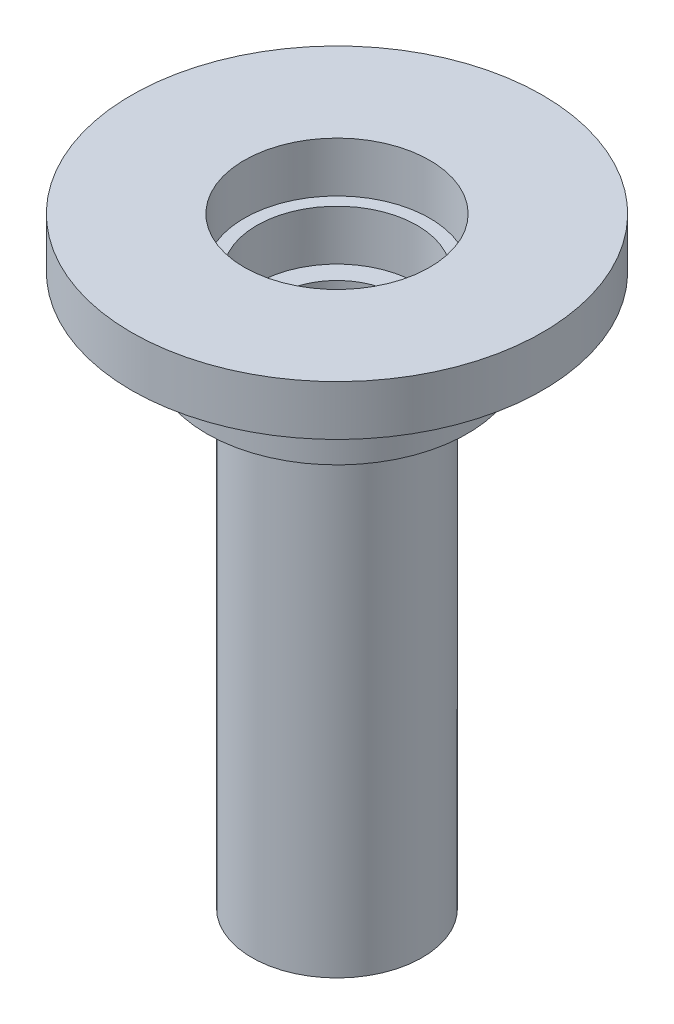
ISO-10303-21;
HEADER;
FILE_DESCRIPTION(('STEP AP214'),'2;1');
FILE_NAME('part.step','',(''),(''),'','','');
FILE_SCHEMA(('AUTOMOTIVE_DESIGN { 1 0 10303 214 1 1 1 1 }'));
ENDSEC;
DATA;
#1=APPLICATION_CONTEXT('core data for automotive mechanical design processes');
#2=APPLICATION_PROTOCOL_DEFINITION('international standard','automotive_design',2000,#1);
#3=PRODUCT_CONTEXT('',#1,'mechanical');
#4=PRODUCT('Part','Part','',(#3));
#5=PRODUCT_RELATED_PRODUCT_CATEGORY('part','',(#4));
#6=PRODUCT_DEFINITION_FORMATION('','',#4);
#7=PRODUCT_DEFINITION_CONTEXT('part definition',#1,'design');
#8=PRODUCT_DEFINITION('design','',#6,#7);
#9=PRODUCT_DEFINITION_SHAPE('','',#8);
#10=(LENGTH_UNIT() NAMED_UNIT(*) SI_UNIT(.MILLI.,.METRE.));
#11=(NAMED_UNIT(*) PLANE_ANGLE_UNIT() SI_UNIT($,.RADIAN.));
#12=(NAMED_UNIT(*) SI_UNIT($,.STERADIAN.) SOLID_ANGLE_UNIT());
#13=UNCERTAINTY_MEASURE_WITH_UNIT(LENGTH_MEASURE(1.E-05),#10,'distance_accuracy_value','');
#14=(GEOMETRIC_REPRESENTATION_CONTEXT(3) GLOBAL_UNCERTAINTY_ASSIGNED_CONTEXT((#13)) GLOBAL_UNIT_ASSIGNED_CONTEXT((#10,
#11,#12)) REPRESENTATION_CONTEXT('',''));
#15=CARTESIAN_POINT('',(0.,0.,0.));
#16=DIRECTION('',(0.,0.,1.));
#17=DIRECTION('',(1.,0.,0.));
#18=AXIS2_PLACEMENT_3D('',#15,#16,#17);
#19=CARTESIAN_POINT('',(-12.,-9.37974031758415,0.));
#20=DIRECTION('',(0.,-1.,0.));
#21=DIRECTION('',(0.,0.,-1.));
#22=AXIS2_PLACEMENT_3D('',#19,#20,#21);
#23=CYLINDRICAL_SURFACE('',#22,16.);
#24=CARTESIAN_POINT('',(-12.,120.,0.));
#25=DIRECTION('',(0.,-1.,0.));
#26=DIRECTION('',(0.,0.,-1.));
#27=AXIS2_PLACEMENT_3D('',#24,#25,#26);
#28=CIRCLE('',#27,16.);
#29=CARTESIAN_POINT('',(-12.,120.,-16.));
#30=VERTEX_POINT('',#29);
#31=EDGE_CURVE('E42',#30,#30,#28,.T.);
#32=ORIENTED_EDGE('',*,*,#31,.T.);
#33=EDGE_LOOP('',(#32));
#34=FACE_BOUND('',#33,.T.);
#35=CARTESIAN_POINT('',(-12.,130.,0.));
#36=DIRECTION('',(0.,1.,0.));
#37=DIRECTION('',(0.,0.,1.));
#38=AXIS2_PLACEMENT_3D('',#35,#36,#37);
#39=CIRCLE('',#38,16.);
#40=CARTESIAN_POINT('',(-12.,130.,16.));
#41=VERTEX_POINT('',#40);
#42=EDGE_CURVE('E38',#41,#41,#39,.T.);
#43=ORIENTED_EDGE('',*,*,#42,.T.);
#44=EDGE_LOOP('',(#43));
#45=FACE_BOUND('',#44,.T.);
#46=ADVANCED_FACE('F34',(#34,#45),#23,.F.);
#47=CARTESIAN_POINT('',(-12.,-9.37974031758415,0.));
#48=DIRECTION('',(0.,-1.,0.));
#49=DIRECTION('',(0.,0.,-1.));
#50=AXIS2_PLACEMENT_3D('',#47,#48,#49);
#51=CYLINDRICAL_SURFACE('',#50,12.);
#52=CARTESIAN_POINT('',(-12.,120.,0.));
#53=DIRECTION('',(0.,-1.,0.));
#54=DIRECTION('',(0.,0.,-1.));
#55=AXIS2_PLACEMENT_3D('',#52,#53,#54);
#56=CIRCLE('',#55,12.);
#57=CARTESIAN_POINT('',(-12.,120.,-12.));
#58=VERTEX_POINT('',#57);
#59=EDGE_CURVE('E10',#58,#58,#56,.T.);
#60=ORIENTED_EDGE('',*,*,#59,.F.);
#61=EDGE_LOOP('',(#60));
#62=FACE_BOUND('',#61,.T.);
#63=CARTESIAN_POINT('',(-12.,34.,0.));
#64=DIRECTION('',(0.,-1.,0.));
#65=DIRECTION('',(0.,0.,-1.));
#66=AXIS2_PLACEMENT_3D('',#63,#64,#65);
#67=CIRCLE('',#66,12.);
#68=CARTESIAN_POINT('',(-12.,34.,-12.));
#69=VERTEX_POINT('',#68);
#70=EDGE_CURVE('E54',#69,#69,#67,.T.);
#71=ORIENTED_EDGE('',*,*,#70,.T.);
#72=EDGE_LOOP('',(#71));
#73=FACE_BOUND('',#72,.T.);
#74=ADVANCED_FACE('F36',(#62,#73),#51,.F.);
#75=CARTESIAN_POINT('',(-12.,-9.37974031758415,0.));
#76=DIRECTION('',(0.,-1.,0.));
#77=DIRECTION('',(0.,0.,-1.));
#78=AXIS2_PLACEMENT_3D('',#75,#76,#77);
#79=CYLINDRICAL_SURFACE('',#78,17.);
#80=CARTESIAN_POINT('',(-12.,115.,0.));
#81=DIRECTION('',(0.,-1.,0.));
#82=DIRECTION('',(0.,0.,-1.));
#83=AXIS2_PLACEMENT_3D('',#80,#81,#82);
#84=CIRCLE('',#83,17.);
#85=CARTESIAN_POINT('',(-12.,115.,-17.));
#86=VERTEX_POINT('',#85);
#87=EDGE_CURVE('E53',#86,#86,#84,.T.);
#88=ORIENTED_EDGE('',*,*,#87,.T.);
#89=EDGE_LOOP('',(#88));
#90=FACE_BOUND('',#89,.T.);
#91=CARTESIAN_POINT('',(-12.,20.,0.));
#92=DIRECTION('',(0.,-1.,0.));
#93=DIRECTION('',(0.,0.,-1.));
#94=AXIS2_PLACEMENT_3D('',#91,#92,#93);
#95=CIRCLE('',#94,17.);
#96=CARTESIAN_POINT('',(-12.,20.,-17.));
#97=VERTEX_POINT('',#96);
#98=EDGE_CURVE('E51',#97,#97,#95,.F.);
#99=ORIENTED_EDGE('',*,*,#98,.T.);
#100=EDGE_LOOP('',(#99));
#101=FACE_BOUND('',#100,.T.);
#102=ADVANCED_FACE('F97',(#90,#101),#79,.T.);
#103=CARTESIAN_POINT('',(0.,120.,0.));
#104=DIRECTION('',(0.,1.,0.));
#105=DIRECTION('',(0.,0.,1.));
#106=AXIS2_PLACEMENT_3D('',#103,#104,#105);
#107=PLANE('',#106);
#108=ORIENTED_EDGE('',*,*,#59,.T.);
#109=EDGE_LOOP('',(#108));
#110=FACE_BOUND('',#109,.T.);
#111=ORIENTED_EDGE('',*,*,#31,.F.);
#112=EDGE_LOOP('',(#111));
#113=FACE_BOUND('',#112,.T.);
#114=ADVANCED_FACE('F88',(#110,#113),#107,.T.);
#115=CARTESIAN_POINT('',(4.,140.,0.));
#116=DIRECTION('',(0.,1.,0.));
#117=DIRECTION('',(0.,0.,1.));
#118=AXIS2_PLACEMENT_3D('',#115,#116,#117);
#119=PLANE('',#118);
#120=CARTESIAN_POINT('',(-12.,140.,0.));
#121=DIRECTION('',(0.,1.,0.));
#122=DIRECTION('',(0.,0.,1.));
#123=AXIS2_PLACEMENT_3D('',#120,#121,#122);
#124=CIRCLE('',#123,18.5);
#125=CARTESIAN_POINT('',(-12.,140.,18.5));
#126=VERTEX_POINT('',#125);
#127=EDGE_CURVE('E67',#126,#126,#124,.T.);
#128=ORIENTED_EDGE('',*,*,#127,.F.);
#129=EDGE_LOOP('',(#128));
#130=FACE_BOUND('',#129,.T.);
#131=CARTESIAN_POINT('',(-12.,140.,0.));
#132=DIRECTION('',(0.,-1.,0.));
#133=DIRECTION('',(0.,0.,-1.));
#134=AXIS2_PLACEMENT_3D('',#131,#132,#133);
#135=CIRCLE('',#134,41.);
#136=CARTESIAN_POINT('',(-12.,140.,-41.));
#137=VERTEX_POINT('',#136);
#138=EDGE_CURVE('E47',#137,#137,#135,.T.);
#139=ORIENTED_EDGE('',*,*,#138,.F.);
#140=EDGE_LOOP('',(#139));
#141=FACE_BOUND('',#140,.T.);
#142=ADVANCED_FACE('F86',(#130,#141),#119,.T.);
#143=CARTESIAN_POINT('',(-12.,-9.37974031758415,0.));
#144=DIRECTION('',(0.,-1.,0.));
#145=DIRECTION('',(0.,0.,-1.));
#146=AXIS2_PLACEMENT_3D('',#143,#144,#145);
#147=CYLINDRICAL_SURFACE('',#146,41.);
#148=ORIENTED_EDGE('',*,*,#138,.T.);
#149=EDGE_LOOP('',(#148));
#150=FACE_BOUND('',#149,.T.);
#151=CARTESIAN_POINT('',(-12.,130.,0.));
#152=DIRECTION('',(0.,-1.,0.));
#153=DIRECTION('',(0.,0.,-1.));
#154=AXIS2_PLACEMENT_3D('',#151,#152,#153);
#155=CIRCLE('',#154,41.);
#156=CARTESIAN_POINT('',(-12.,130.,-41.));
#157=VERTEX_POINT('',#156);
#158=EDGE_CURVE('E78',#157,#157,#155,.T.);
#159=ORIENTED_EDGE('',*,*,#158,.F.);
#160=EDGE_LOOP('',(#159));
#161=FACE_BOUND('',#160,.T.);
#162=ADVANCED_FACE('F83',(#150,#161),#147,.T.);
#163=CARTESIAN_POINT('',(29.,130.,0.));
#164=DIRECTION('',(0.,-1.,0.));
#165=DIRECTION('',(0.,0.,-1.));
#166=AXIS2_PLACEMENT_3D('',#163,#164,#165);
#167=PLANE('',#166);
#168=ORIENTED_EDGE('',*,*,#158,.T.);
#169=EDGE_LOOP('',(#168));
#170=FACE_BOUND('',#169,.T.);
#171=CARTESIAN_POINT('',(-12.,130.,0.));
#172=DIRECTION('',(0.,-1.,0.));
#173=DIRECTION('',(0.,0.,-1.));
#174=AXIS2_PLACEMENT_3D('',#171,#172,#173);
#175=CIRCLE('',#174,26.);
#176=CARTESIAN_POINT('',(-12.,130.,-26.));
#177=VERTEX_POINT('',#176);
#178=EDGE_CURVE('E75',#177,#177,#175,.T.);
#179=ORIENTED_EDGE('',*,*,#178,.F.);
#180=EDGE_LOOP('',(#179));
#181=FACE_BOUND('',#180,.T.);
#182=ADVANCED_FACE('F95',(#170,#181),#167,.T.);
#183=CARTESIAN_POINT('',(-12.,-9.37974031758415,0.));
#184=DIRECTION('',(0.,-1.,0.));
#185=DIRECTION('',(0.,0.,-1.));
#186=AXIS2_PLACEMENT_3D('',#183,#184,#185);
#187=CYLINDRICAL_SURFACE('',#186,26.);
#188=ORIENTED_EDGE('',*,*,#178,.T.);
#189=EDGE_LOOP('',(#188));
#190=FACE_BOUND('',#189,.T.);
#191=CARTESIAN_POINT('',(-12.,115.,0.));
#192=DIRECTION('',(0.,-1.,0.));
#193=DIRECTION('',(0.,0.,-1.));
#194=AXIS2_PLACEMENT_3D('',#191,#192,#193);
#195=CIRCLE('',#194,26.);
#196=CARTESIAN_POINT('',(-12.,115.,-26.));
#197=VERTEX_POINT('',#196);
#198=EDGE_CURVE('E72',#197,#197,#195,.T.);
#199=ORIENTED_EDGE('',*,*,#198,.F.);
#200=EDGE_LOOP('',(#199));
#201=FACE_BOUND('',#200,.T.);
#202=ADVANCED_FACE('F145',(#190,#201),#187,.T.);
#203=CARTESIAN_POINT('',(14.,115.,0.));
#204=DIRECTION('',(0.,-1.,0.));
#205=DIRECTION('',(0.,0.,-1.));
#206=AXIS2_PLACEMENT_3D('',#203,#204,#205);
#207=PLANE('',#206);
#208=ORIENTED_EDGE('',*,*,#198,.T.);
#209=EDGE_LOOP('',(#208));
#210=FACE_BOUND('',#209,.T.);
#211=ORIENTED_EDGE('',*,*,#87,.F.);
#212=EDGE_LOOP('',(#211));
#213=FACE_BOUND('',#212,.T.);
#214=ADVANCED_FACE('F138',(#210,#213),#207,.T.);
#215=CARTESIAN_POINT('',(-12.,20.,0.));
#216=DIRECTION('',(0.,-1.,0.));
#217=DIRECTION('',(0.,0.,-1.));
#218=AXIS2_PLACEMENT_3D('',#215,#216,#217);
#219=PLANE('',#218);
#220=CARTESIAN_POINT('',(-12.,20.,0.));
#221=DIRECTION('',(0.,-1.,0.));
#222=DIRECTION('',(0.,0.,-1.));
#223=AXIS2_PLACEMENT_3D('',#220,#221,#222);
#224=CIRCLE('',#223,14.);
#225=CARTESIAN_POINT('',(-12.,20.,-14.));
#226=VERTEX_POINT('',#225);
#227=EDGE_CURVE('E60',#226,#226,#224,.T.);
#228=ORIENTED_EDGE('',*,*,#227,.F.);
#229=EDGE_LOOP('',(#228));
#230=FACE_BOUND('',#229,.T.);
#231=ORIENTED_EDGE('',*,*,#98,.F.);
#232=EDGE_LOOP('',(#231));
#233=FACE_BOUND('',#232,.T.);
#234=ADVANCED_FACE('F134',(#230,#233),#219,.T.);
#235=CARTESIAN_POINT('',(-12.,34.,0.));
#236=DIRECTION('',(0.,-1.,0.));
#237=DIRECTION('',(0.,0.,-1.));
#238=AXIS2_PLACEMENT_3D('',#235,#236,#237);
#239=CYLINDRICAL_SURFACE('',#238,14.);
#240=CARTESIAN_POINT('',(-12.,34.,0.));
#241=DIRECTION('',(0.,-1.,0.));
#242=DIRECTION('',(0.,0.,-1.));
#243=AXIS2_PLACEMENT_3D('',#240,#241,#242);
#244=CIRCLE('',#243,14.);
#245=CARTESIAN_POINT('',(-12.,34.,-14.));
#246=VERTEX_POINT('',#245);
#247=EDGE_CURVE('E56',#246,#246,#244,.T.);
#248=ORIENTED_EDGE('',*,*,#247,.F.);
#249=EDGE_LOOP('',(#248));
#250=FACE_BOUND('',#249,.T.);
#251=ORIENTED_EDGE('',*,*,#227,.T.);
#252=EDGE_LOOP('',(#251));
#253=FACE_BOUND('',#252,.T.);
#254=ADVANCED_FACE('F128',(#250,#253),#239,.F.);
#255=CARTESIAN_POINT('',(-12.,34.,0.));
#256=DIRECTION('',(0.,-1.,0.));
#257=DIRECTION('',(0.,0.,-1.));
#258=AXIS2_PLACEMENT_3D('',#255,#256,#257);
#259=PLANE('',#258);
#260=ORIENTED_EDGE('',*,*,#70,.F.);
#261=EDGE_LOOP('',(#260));
#262=FACE_BOUND('',#261,.T.);
#263=ORIENTED_EDGE('',*,*,#247,.T.);
#264=EDGE_LOOP('',(#263));
#265=FACE_BOUND('',#264,.T.);
#266=ADVANCED_FACE('F120',(#262,#265),#259,.T.);
#267=CARTESIAN_POINT('',(-12.,130.,0.));
#268=DIRECTION('',(0.,1.,0.));
#269=DIRECTION('',(0.,0.,1.));
#270=AXIS2_PLACEMENT_3D('',#267,#268,#269);
#271=CYLINDRICAL_SURFACE('',#270,18.5);
#272=CARTESIAN_POINT('',(-12.,130.,0.));
#273=DIRECTION('',(0.,1.,0.));
#274=DIRECTION('',(0.,0.,1.));
#275=AXIS2_PLACEMENT_3D('',#272,#273,#274);
#276=CIRCLE('',#275,18.5);
#277=CARTESIAN_POINT('',(-12.,130.,18.5));
#278=VERTEX_POINT('',#277);
#279=EDGE_CURVE('E111',#278,#278,#276,.T.);
#280=ORIENTED_EDGE('',*,*,#279,.F.);
#281=EDGE_LOOP('',(#280));
#282=FACE_BOUND('',#281,.T.);
#283=ORIENTED_EDGE('',*,*,#127,.T.);
#284=EDGE_LOOP('',(#283));
#285=FACE_BOUND('',#284,.T.);
#286=ADVANCED_FACE('F117',(#282,#285),#271,.F.);
#287=CARTESIAN_POINT('',(-12.,130.,0.));
#288=DIRECTION('',(0.,1.,0.));
#289=DIRECTION('',(0.,0.,1.));
#290=AXIS2_PLACEMENT_3D('',#287,#288,#289);
#291=PLANE('',#290);
#292=ORIENTED_EDGE('',*,*,#42,.F.);
#293=EDGE_LOOP('',(#292));
#294=FACE_BOUND('',#293,.T.);
#295=ORIENTED_EDGE('',*,*,#279,.T.);
#296=EDGE_LOOP('',(#295));
#297=FACE_BOUND('',#296,.T.);
#298=ADVANCED_FACE('F119',(#294,#297),#291,.T.);
#299=CLOSED_SHELL('',(#46,#74,#102,#114,#142,#162,#182,#202,#214,#234,#254,#266,#286,#298));
#300=MANIFOLD_SOLID_BREP('B2',#299);
#301=ADVANCED_BREP_SHAPE_REPRESENTATION('',(#18,#300),#14);
#302=SHAPE_DEFINITION_REPRESENTATION(#9,#301);
ENDSEC;
END-ISO-10303-21;
